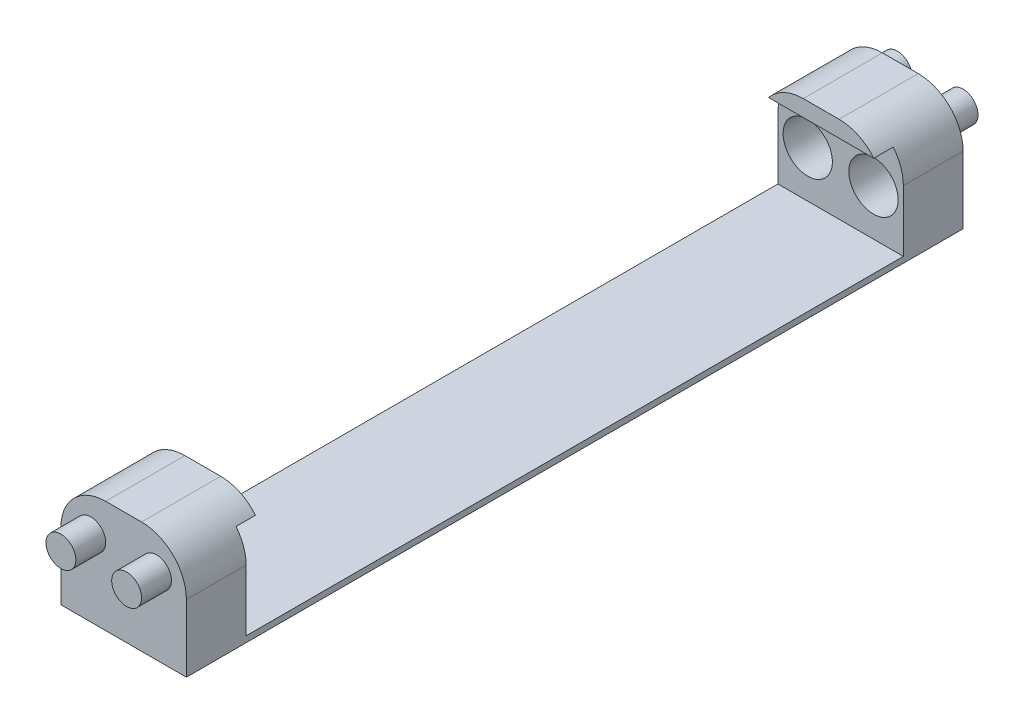
ISO-10303-21;
HEADER;
FILE_DESCRIPTION(('STEP AP214'),'2;1');
FILE_NAME('part.step','',(''),(''),'','','');
FILE_SCHEMA(('AUTOMOTIVE_DESIGN { 1 0 10303 214 1 1 1 1 }'));
ENDSEC;
DATA;
#1=APPLICATION_CONTEXT('core data for automotive mechanical design processes');
#2=APPLICATION_PROTOCOL_DEFINITION('international standard','automotive_design',2000,#1);
#3=PRODUCT_CONTEXT('',#1,'mechanical');
#4=PRODUCT('Part','Part','',(#3));
#5=PRODUCT_RELATED_PRODUCT_CATEGORY('part','',(#4));
#6=PRODUCT_DEFINITION_FORMATION('','',#4);
#7=PRODUCT_DEFINITION_CONTEXT('part definition',#1,'design');
#8=PRODUCT_DEFINITION('design','',#6,#7);
#9=PRODUCT_DEFINITION_SHAPE('','',#8);
#10=(LENGTH_UNIT() NAMED_UNIT(*) SI_UNIT(.MILLI.,.METRE.));
#11=(NAMED_UNIT(*) PLANE_ANGLE_UNIT() SI_UNIT($,.RADIAN.));
#12=(NAMED_UNIT(*) SI_UNIT($,.STERADIAN.) SOLID_ANGLE_UNIT());
#13=UNCERTAINTY_MEASURE_WITH_UNIT(LENGTH_MEASURE(1.E-05),#10,'distance_accuracy_value','');
#14=(GEOMETRIC_REPRESENTATION_CONTEXT(3) GLOBAL_UNCERTAINTY_ASSIGNED_CONTEXT((#13)) GLOBAL_UNIT_ASSIGNED_CONTEXT((#10,
#11,#12)) REPRESENTATION_CONTEXT('',''));
#15=CARTESIAN_POINT('',(0.,0.,0.));
#16=DIRECTION('',(0.,0.,1.));
#17=DIRECTION('',(1.,0.,0.));
#18=AXIS2_PLACEMENT_3D('',#15,#16,#17);
#19=CARTESIAN_POINT('',(-42.,0.,260.));
#20=DIRECTION('',(0.,0.,1.));
#21=DIRECTION('',(1.,0.,0.));
#22=AXIS2_PLACEMENT_3D('',#19,#20,#21);
#23=PLANE('',#22);
#24=CARTESIAN_POINT('',(-22.,51.,260.));
#25=DIRECTION('',(0.,0.,1.));
#26=DIRECTION('',(1.,0.,0.));
#27=AXIS2_PLACEMENT_3D('',#24,#25,#26);
#28=CIRCLE('',#27,10.);
#29=CARTESIAN_POINT('',(-12.,51.,260.));
#30=VERTEX_POINT('',#29);
#31=EDGE_CURVE('E429',#30,#30,#28,.T.);
#32=ORIENTED_EDGE('',*,*,#31,.F.);
#33=EDGE_LOOP('',(#32));
#34=FACE_BOUND('',#33,.T.);
#35=CARTESIAN_POINT('',(22.,51.,260.));
#36=DIRECTION('',(0.,0.,1.));
#37=DIRECTION('',(1.,0.,0.));
#38=AXIS2_PLACEMENT_3D('',#35,#36,#37);
#39=CIRCLE('',#38,10.);
#40=CARTESIAN_POINT('',(32.,51.,260.));
#41=VERTEX_POINT('',#40);
#42=EDGE_CURVE('E438',#41,#41,#39,.T.);
#43=ORIENTED_EDGE('',*,*,#42,.F.);
#44=EDGE_LOOP('',(#43));
#45=FACE_BOUND('',#44,.T.);
#46=DIRECTION('',(1.,0.,0.));
#47=VECTOR('',#46,1.);
#48=CARTESIAN_POINT('',(-42.,75.,260.));
#49=LINE('',#48,#47);
#50=CARTESIAN_POINT('',(-12.,75.,260.));
#51=VERTEX_POINT('',#50);
#52=CARTESIAN_POINT('',(12.,75.,260.));
#53=VERTEX_POINT('',#52);
#54=EDGE_CURVE('E204',#51,#53,#49,.T.);
#55=ORIENTED_EDGE('',*,*,#54,.F.);
#56=CARTESIAN_POINT('',(-12.,45.,260.));
#57=DIRECTION('',(0.,0.,1.));
#58=DIRECTION('',(1.,0.,0.));
#59=AXIS2_PLACEMENT_3D('',#56,#57,#58);
#60=CIRCLE('',#59,30.);
#61=CARTESIAN_POINT('',(-42.,45.,260.));
#62=VERTEX_POINT('',#61);
#63=EDGE_CURVE('E268',#51,#62,#60,.T.);
#64=ORIENTED_EDGE('',*,*,#63,.T.);
#65=DIRECTION('',(0.,-1.,0.));
#66=VECTOR('',#65,1.);
#67=CARTESIAN_POINT('',(-42.,0.,260.));
#68=LINE('',#67,#66);
#69=CARTESIAN_POINT('',(-42.,0.,260.));
#70=VERTEX_POINT('',#69);
#71=EDGE_CURVE('E171',#62,#70,#68,.T.);
#72=ORIENTED_EDGE('',*,*,#71,.T.);
#73=DIRECTION('',(1.,0.,0.));
#74=VECTOR('',#73,1.);
#75=CARTESIAN_POINT('',(-42.,0.,260.));
#76=LINE('',#75,#74);
#77=CARTESIAN_POINT('',(42.,0.,260.));
#78=VERTEX_POINT('',#77);
#79=EDGE_CURVE('E168',#70,#78,#76,.T.);
#80=ORIENTED_EDGE('',*,*,#79,.T.);
#81=DIRECTION('',(0.,-1.,0.));
#82=VECTOR('',#81,1.);
#83=CARTESIAN_POINT('',(42.,0.,260.));
#84=LINE('',#83,#82);
#85=CARTESIAN_POINT('',(42.,45.,260.));
#86=VERTEX_POINT('',#85);
#87=EDGE_CURVE('E154',#86,#78,#84,.T.);
#88=ORIENTED_EDGE('',*,*,#87,.F.);
#89=CARTESIAN_POINT('',(12.,45.,260.));
#90=DIRECTION('',(0.,0.,1.));
#91=DIRECTION('',(1.,0.,0.));
#92=AXIS2_PLACEMENT_3D('',#89,#90,#91);
#93=CIRCLE('',#92,30.);
#94=EDGE_CURVE('E266',#86,#53,#93,.T.);
#95=ORIENTED_EDGE('',*,*,#94,.T.);
#96=EDGE_LOOP('',(#55,#64,#72,#80,#88,#95));
#97=FACE_BOUND('',#96,.T.);
#98=ADVANCED_FACE('F38',(#34,#45,#97),#23,.T.);
#99=CARTESIAN_POINT('',(-42.,75.,207.));
#100=DIRECTION('',(0.,1.,0.));
#101=DIRECTION('',(0.,0.,1.));
#102=AXIS2_PLACEMENT_3D('',#99,#100,#101);
#103=PLANE('',#102);
#104=DIRECTION('',(1.,0.,0.));
#105=VECTOR('',#104,1.);
#106=CARTESIAN_POINT('',(-42.,75.,207.));
#107=LINE('',#106,#105);
#108=CARTESIAN_POINT('',(-12.,75.,207.));
#109=VERTEX_POINT('',#108);
#110=CARTESIAN_POINT('',(12.,75.,207.));
#111=VERTEX_POINT('',#110);
#112=EDGE_CURVE('E208',#109,#111,#107,.T.);
#113=ORIENTED_EDGE('',*,*,#112,.F.);
#114=DIRECTION('',(0.,0.,1.));
#115=VECTOR('',#114,1.);
#116=CARTESIAN_POINT('',(-12.,75.,260.));
#117=LINE('',#116,#115);
#118=EDGE_CURVE('E263',#109,#51,#117,.T.);
#119=ORIENTED_EDGE('',*,*,#118,.T.);
#120=ORIENTED_EDGE('',*,*,#54,.T.);
#121=DIRECTION('',(0.,0.,1.));
#122=VECTOR('',#121,1.);
#123=CARTESIAN_POINT('',(12.,75.,207.));
#124=LINE('',#123,#122);
#125=EDGE_CURVE('E261',#53,#111,#124,.F.);
#126=ORIENTED_EDGE('',*,*,#125,.T.);
#127=EDGE_LOOP('',(#113,#119,#120,#126));
#128=FACE_BOUND('',#127,.T.);
#129=ADVANCED_FACE('F329',(#128),#103,.T.);
#130=CARTESIAN_POINT('',(-42.,64.,207.));
#131=DIRECTION('',(0.,0.,-1.));
#132=DIRECTION('',(-1.,0.,0.));
#133=AXIS2_PLACEMENT_3D('',#130,#131,#132);
#134=PLANE('',#133);
#135=DIRECTION('',(1.,0.,0.));
#136=VECTOR('',#135,1.);
#137=CARTESIAN_POINT('',(-42.,64.,207.));
#138=LINE('',#137,#136);
#139=CARTESIAN_POINT('',(-35.2163735324878,64.,207.));
#140=VERTEX_POINT('',#139);
#141=CARTESIAN_POINT('',(35.2163735324878,64.,207.));
#142=VERTEX_POINT('',#141);
#143=EDGE_CURVE('E210',#140,#142,#138,.T.);
#144=ORIENTED_EDGE('',*,*,#143,.F.);
#145=CARTESIAN_POINT('',(-12.,45.,207.));
#146=DIRECTION('',(0.,0.,-1.));
#147=DIRECTION('',(-1.,0.,0.));
#148=AXIS2_PLACEMENT_3D('',#145,#146,#147);
#149=CIRCLE('',#148,30.);
#150=EDGE_CURVE('E11',#140,#109,#149,.T.);
#151=ORIENTED_EDGE('',*,*,#150,.T.);
#152=ORIENTED_EDGE('',*,*,#112,.T.);
#153=CARTESIAN_POINT('',(12.,45.,207.));
#154=DIRECTION('',(0.,0.,-1.));
#155=DIRECTION('',(-1.,0.,0.));
#156=AXIS2_PLACEMENT_3D('',#153,#154,#155);
#157=CIRCLE('',#156,30.);
#158=EDGE_CURVE('E47',#111,#142,#157,.T.);
#159=ORIENTED_EDGE('',*,*,#158,.T.);
#160=EDGE_LOOP('',(#144,#151,#152,#159));
#161=FACE_BOUND('',#160,.T.);
#162=ADVANCED_FACE('F335',(#161),#134,.T.);
#163=CARTESIAN_POINT('',(-42.,64.,220.));
#164=DIRECTION('',(0.,-1.,0.));
#165=DIRECTION('',(0.,0.,-1.));
#166=AXIS2_PLACEMENT_3D('',#163,#164,#165);
#167=PLANE('',#166);
#168=DIRECTION('',(1.,0.,0.));
#169=VECTOR('',#168,1.);
#170=CARTESIAN_POINT('',(-42.,64.,220.));
#171=LINE('',#170,#169);
#172=CARTESIAN_POINT('',(-35.2163735324878,64.,220.));
#173=VERTEX_POINT('',#172);
#174=CARTESIAN_POINT('',(35.2163735324878,64.,220.));
#175=VERTEX_POINT('',#174);
#176=EDGE_CURVE('E212',#173,#175,#171,.T.);
#177=ORIENTED_EDGE('',*,*,#176,.F.);
#178=DIRECTION('',(0.,0.,-1.));
#179=VECTOR('',#178,1.);
#180=CARTESIAN_POINT('',(-35.2163735324878,64.,220.));
#181=LINE('',#180,#179);
#182=EDGE_CURVE('E61',#173,#140,#181,.T.);
#183=ORIENTED_EDGE('',*,*,#182,.T.);
#184=ORIENTED_EDGE('',*,*,#143,.T.);
#185=DIRECTION('',(0.,0.,1.));
#186=VECTOR('',#185,1.);
#187=CARTESIAN_POINT('',(35.2163735324878,64.,207.));
#188=LINE('',#187,#186);
#189=EDGE_CURVE('E274',#142,#175,#188,.T.);
#190=ORIENTED_EDGE('',*,*,#189,.T.);
#191=EDGE_LOOP('',(#177,#183,#184,#190));
#192=FACE_BOUND('',#191,.T.);
#193=ADVANCED_FACE('F364',(#192),#167,.T.);
#194=CARTESIAN_POINT('',(-42.,4.,220.));
#195=DIRECTION('',(0.,0.,-1.));
#196=DIRECTION('',(-1.,0.,0.));
#197=AXIS2_PLACEMENT_3D('',#194,#195,#196);
#198=PLANE('',#197);
#199=CARTESIAN_POINT('',(22.,35.,220.));
#200=DIRECTION('',(0.,0.,-1.));
#201=DIRECTION('',(-1.,0.,0.));
#202=AXIS2_PLACEMENT_3D('',#199,#200,#201);
#203=CIRCLE('',#202,16.5);
#204=CARTESIAN_POINT('',(5.5,35.,220.));
#205=VERTEX_POINT('',#204);
#206=EDGE_CURVE('E165',#205,#205,#203,.F.);
#207=ORIENTED_EDGE('',*,*,#206,.T.);
#208=EDGE_LOOP('',(#207));
#209=FACE_BOUND('',#208,.T.);
#210=CARTESIAN_POINT('',(-22.,35.,220.));
#211=DIRECTION('',(0.,0.,-1.));
#212=DIRECTION('',(-1.,0.,0.));
#213=AXIS2_PLACEMENT_3D('',#210,#211,#212);
#214=CIRCLE('',#213,16.5);
#215=CARTESIAN_POINT('',(-38.5,35.,220.));
#216=VERTEX_POINT('',#215);
#217=EDGE_CURVE('E279',#216,#216,#214,.F.);
#218=ORIENTED_EDGE('',*,*,#217,.T.);
#219=EDGE_LOOP('',(#218));
#220=FACE_BOUND('',#219,.T.);
#221=DIRECTION('',(0.,1.,0.));
#222=VECTOR('',#221,1.);
#223=CARTESIAN_POINT('',(-42.,4.,220.));
#224=LINE('',#223,#222);
#225=CARTESIAN_POINT('',(-42.,4.,220.));
#226=VERTEX_POINT('',#225);
#227=CARTESIAN_POINT('',(-42.,45.,220.));
#228=VERTEX_POINT('',#227);
#229=EDGE_CURVE('E176',#226,#228,#224,.T.);
#230=ORIENTED_EDGE('',*,*,#229,.T.);
#231=CARTESIAN_POINT('',(-12.,45.,220.));
#232=DIRECTION('',(0.,0.,-1.));
#233=DIRECTION('',(-1.,0.,0.));
#234=AXIS2_PLACEMENT_3D('',#231,#232,#233);
#235=CIRCLE('',#234,30.);
#236=EDGE_CURVE('E272',#228,#173,#235,.T.);
#237=ORIENTED_EDGE('',*,*,#236,.T.);
#238=ORIENTED_EDGE('',*,*,#176,.T.);
#239=CARTESIAN_POINT('',(12.,45.,220.));
#240=DIRECTION('',(0.,0.,-1.));
#241=DIRECTION('',(-1.,0.,0.));
#242=AXIS2_PLACEMENT_3D('',#239,#240,#241);
#243=CIRCLE('',#242,30.);
#244=CARTESIAN_POINT('',(42.,45.,220.));
#245=VERTEX_POINT('',#244);
#246=EDGE_CURVE('E270',#175,#245,#243,.T.);
#247=ORIENTED_EDGE('',*,*,#246,.T.);
#248=DIRECTION('',(0.,1.,0.));
#249=VECTOR('',#248,1.);
#250=CARTESIAN_POINT('',(42.,4.,220.));
#251=LINE('',#250,#249);
#252=CARTESIAN_POINT('',(42.,4.,220.));
#253=VERTEX_POINT('',#252);
#254=EDGE_CURVE('E189',#253,#245,#251,.T.);
#255=ORIENTED_EDGE('',*,*,#254,.F.);
#256=DIRECTION('',(1.,0.,0.));
#257=VECTOR('',#256,1.);
#258=CARTESIAN_POINT('',(-42.,4.,220.));
#259=LINE('',#258,#257);
#260=EDGE_CURVE('E215',#226,#253,#259,.T.);
#261=ORIENTED_EDGE('',*,*,#260,.F.);
#262=EDGE_LOOP('',(#230,#237,#238,#247,#255,#261));
#263=FACE_BOUND('',#262,.T.);
#264=ADVANCED_FACE('F361',(#209,#220,#263),#198,.T.);
#265=CARTESIAN_POINT('',(-42.,4.,220.));
#266=DIRECTION('',(0.,1.,0.));
#267=DIRECTION('',(0.,0.,1.));
#268=AXIS2_PLACEMENT_3D('',#265,#266,#267);
#269=PLANE('',#268);
#270=ORIENTED_EDGE('',*,*,#260,.T.);
#271=DIRECTION('',(0.,0.,1.));
#272=VECTOR('',#271,1.);
#273=CARTESIAN_POINT('',(42.,4.,220.));
#274=LINE('',#273,#272);
#275=CARTESIAN_POINT('',(42.,4.,-220.));
#276=VERTEX_POINT('',#275);
#277=EDGE_CURVE('E186',#276,#253,#274,.T.);
#278=ORIENTED_EDGE('',*,*,#277,.F.);
#279=DIRECTION('',(1.,0.,0.));
#280=VECTOR('',#279,1.);
#281=CARTESIAN_POINT('',(-42.,4.,-220.));
#282=LINE('',#281,#280);
#283=CARTESIAN_POINT('',(-42.,4.,-220.));
#284=VERTEX_POINT('',#283);
#285=EDGE_CURVE('E217',#284,#276,#282,.T.);
#286=ORIENTED_EDGE('',*,*,#285,.F.);
#287=DIRECTION('',(0.,0.,1.));
#288=VECTOR('',#287,1.);
#289=CARTESIAN_POINT('',(-42.,4.,220.));
#290=LINE('',#289,#288);
#291=EDGE_CURVE('E199',#284,#226,#290,.T.);
#292=ORIENTED_EDGE('',*,*,#291,.T.);
#293=EDGE_LOOP('',(#270,#278,#286,#292));
#294=FACE_BOUND('',#293,.T.);
#295=ADVANCED_FACE('F372',(#294),#269,.T.);
#296=CARTESIAN_POINT('',(-42.,4.,-220.));
#297=DIRECTION('',(0.,0.,1.));
#298=DIRECTION('',(1.,0.,0.));
#299=AXIS2_PLACEMENT_3D('',#296,#297,#298);
#300=PLANE('',#299);
#301=CARTESIAN_POINT('',(22.,35.,-220.));
#302=DIRECTION('',(0.,0.,1.));
#303=DIRECTION('',(1.,0.,0.));
#304=AXIS2_PLACEMENT_3D('',#301,#302,#303);
#305=CIRCLE('',#304,16.5);
#306=CARTESIAN_POINT('',(38.5,35.,-220.));
#307=VERTEX_POINT('',#306);
#308=EDGE_CURVE('E42',#307,#307,#305,.F.);
#309=ORIENTED_EDGE('',*,*,#308,.T.);
#310=EDGE_LOOP('',(#309));
#311=FACE_BOUND('',#310,.T.);
#312=CARTESIAN_POINT('',(-22.,35.,-220.));
#313=DIRECTION('',(0.,0.,1.));
#314=DIRECTION('',(1.,0.,0.));
#315=AXIS2_PLACEMENT_3D('',#312,#313,#314);
#316=CIRCLE('',#315,16.5);
#317=CARTESIAN_POINT('',(-5.5,35.,-220.));
#318=VERTEX_POINT('',#317);
#319=EDGE_CURVE('E277',#318,#318,#316,.F.);
#320=ORIENTED_EDGE('',*,*,#319,.T.);
#321=EDGE_LOOP('',(#320));
#322=FACE_BOUND('',#321,.T.);
#323=DIRECTION('',(1.,0.,0.));
#324=VECTOR('',#323,1.);
#325=CARTESIAN_POINT('',(-42.,64.,-220.));
#326=LINE('',#325,#324);
#327=CARTESIAN_POINT('',(-35.2163735324878,64.,-220.));
#328=VERTEX_POINT('',#327);
#329=CARTESIAN_POINT('',(35.2163735324878,64.,-220.));
#330=VERTEX_POINT('',#329);
#331=EDGE_CURVE('E220',#328,#330,#326,.T.);
#332=ORIENTED_EDGE('',*,*,#331,.F.);
#333=CARTESIAN_POINT('',(-12.,45.,-220.));
#334=DIRECTION('',(0.,0.,1.));
#335=DIRECTION('',(1.,0.,0.));
#336=AXIS2_PLACEMENT_3D('',#333,#334,#335);
#337=CIRCLE('',#336,30.);
#338=CARTESIAN_POINT('',(-42.,45.,-220.));
#339=VERTEX_POINT('',#338);
#340=EDGE_CURVE('E247',#328,#339,#337,.T.);
#341=ORIENTED_EDGE('',*,*,#340,.T.);
#342=DIRECTION('',(0.,-1.,0.));
#343=VECTOR('',#342,1.);
#344=CARTESIAN_POINT('',(-42.,4.,-220.));
#345=LINE('',#344,#343);
#346=EDGE_CURVE('E197',#339,#284,#345,.T.);
#347=ORIENTED_EDGE('',*,*,#346,.T.);
#348=ORIENTED_EDGE('',*,*,#285,.T.);
#349=DIRECTION('',(0.,-1.,0.));
#350=VECTOR('',#349,1.);
#351=CARTESIAN_POINT('',(42.,4.,-220.));
#352=LINE('',#351,#350);
#353=CARTESIAN_POINT('',(42.,45.,-220.));
#354=VERTEX_POINT('',#353);
#355=EDGE_CURVE('E181',#354,#276,#352,.T.);
#356=ORIENTED_EDGE('',*,*,#355,.F.);
#357=CARTESIAN_POINT('',(12.,45.,-220.));
#358=DIRECTION('',(0.,0.,1.));
#359=DIRECTION('',(1.,0.,0.));
#360=AXIS2_PLACEMENT_3D('',#357,#358,#359);
#361=CIRCLE('',#360,30.);
#362=EDGE_CURVE('E245',#354,#330,#361,.T.);
#363=ORIENTED_EDGE('',*,*,#362,.T.);
#364=EDGE_LOOP('',(#332,#341,#347,#348,#356,#363));
#365=FACE_BOUND('',#364,.T.);
#366=ADVANCED_FACE('F306',(#311,#322,#365),#300,.T.);
#367=CARTESIAN_POINT('',(-42.,64.,-220.));
#368=DIRECTION('',(0.,-1.,0.));
#369=DIRECTION('',(0.,0.,-1.));
#370=AXIS2_PLACEMENT_3D('',#367,#368,#369);
#371=PLANE('',#370);
#372=DIRECTION('',(1.,0.,0.));
#373=VECTOR('',#372,1.);
#374=CARTESIAN_POINT('',(-42.,64.,-207.));
#375=LINE('',#374,#373);
#376=CARTESIAN_POINT('',(-35.2163735324878,64.,-207.));
#377=VERTEX_POINT('',#376);
#378=CARTESIAN_POINT('',(35.2163735324878,64.,-207.));
#379=VERTEX_POINT('',#378);
#380=EDGE_CURVE('E223',#377,#379,#375,.T.);
#381=ORIENTED_EDGE('',*,*,#380,.F.);
#382=DIRECTION('',(0.,0.,-1.));
#383=VECTOR('',#382,1.);
#384=CARTESIAN_POINT('',(-35.2163735324878,64.,-207.));
#385=LINE('',#384,#383);
#386=EDGE_CURVE('E243',#377,#328,#385,.T.);
#387=ORIENTED_EDGE('',*,*,#386,.T.);
#388=ORIENTED_EDGE('',*,*,#331,.T.);
#389=DIRECTION('',(0.,0.,1.));
#390=VECTOR('',#389,1.);
#391=CARTESIAN_POINT('',(35.2163735324878,64.,-220.));
#392=LINE('',#391,#390);
#393=EDGE_CURVE('E241',#330,#379,#392,.T.);
#394=ORIENTED_EDGE('',*,*,#393,.T.);
#395=EDGE_LOOP('',(#381,#387,#388,#394));
#396=FACE_BOUND('',#395,.T.);
#397=ADVANCED_FACE('F400',(#396),#371,.T.);
#398=CARTESIAN_POINT('',(-42.,64.,-207.));
#399=DIRECTION('',(0.,0.,1.));
#400=DIRECTION('',(1.,0.,0.));
#401=AXIS2_PLACEMENT_3D('',#398,#399,#400);
#402=PLANE('',#401);
#403=DIRECTION('',(1.,0.,0.));
#404=VECTOR('',#403,1.);
#405=CARTESIAN_POINT('',(-42.,75.,-207.));
#406=LINE('',#405,#404);
#407=CARTESIAN_POINT('',(-12.,75.,-207.));
#408=VERTEX_POINT('',#407);
#409=CARTESIAN_POINT('',(12.,75.,-207.));
#410=VERTEX_POINT('',#409);
#411=EDGE_CURVE('E226',#408,#410,#406,.T.);
#412=ORIENTED_EDGE('',*,*,#411,.F.);
#413=CARTESIAN_POINT('',(-12.,45.,-207.));
#414=DIRECTION('',(0.,0.,1.));
#415=DIRECTION('',(1.,0.,0.));
#416=AXIS2_PLACEMENT_3D('',#413,#414,#415);
#417=CIRCLE('',#416,30.);
#418=EDGE_CURVE('E239',#408,#377,#417,.T.);
#419=ORIENTED_EDGE('',*,*,#418,.T.);
#420=ORIENTED_EDGE('',*,*,#380,.T.);
#421=CARTESIAN_POINT('',(12.,45.,-207.));
#422=DIRECTION('',(0.,0.,1.));
#423=DIRECTION('',(1.,0.,0.));
#424=AXIS2_PLACEMENT_3D('',#421,#422,#423);
#425=CIRCLE('',#424,30.);
#426=EDGE_CURVE('E237',#379,#410,#425,.T.);
#427=ORIENTED_EDGE('',*,*,#426,.T.);
#428=EDGE_LOOP('',(#412,#419,#420,#427));
#429=FACE_BOUND('',#428,.T.);
#430=ADVANCED_FACE('F391',(#429),#402,.T.);
#431=CARTESIAN_POINT('',(-42.,75.,-207.));
#432=DIRECTION('',(0.,1.,0.));
#433=DIRECTION('',(0.,0.,1.));
#434=AXIS2_PLACEMENT_3D('',#431,#432,#433);
#435=PLANE('',#434);
#436=DIRECTION('',(1.,0.,0.));
#437=VECTOR('',#436,1.);
#438=CARTESIAN_POINT('',(-42.,75.,-260.));
#439=LINE('',#438,#437);
#440=CARTESIAN_POINT('',(-12.,75.,-260.));
#441=VERTEX_POINT('',#440);
#442=CARTESIAN_POINT('',(12.,75.,-260.));
#443=VERTEX_POINT('',#442);
#444=EDGE_CURVE('E229',#441,#443,#439,.T.);
#445=ORIENTED_EDGE('',*,*,#444,.F.);
#446=DIRECTION('',(0.,0.,1.));
#447=VECTOR('',#446,1.);
#448=CARTESIAN_POINT('',(-12.,75.,-207.));
#449=LINE('',#448,#447);
#450=EDGE_CURVE('E234',#441,#408,#449,.T.);
#451=ORIENTED_EDGE('',*,*,#450,.T.);
#452=ORIENTED_EDGE('',*,*,#411,.T.);
#453=DIRECTION('',(0.,0.,1.));
#454=VECTOR('',#453,1.);
#455=CARTESIAN_POINT('',(12.,75.,-207.));
#456=LINE('',#455,#454);
#457=EDGE_CURVE('E207',#410,#443,#456,.F.);
#458=ORIENTED_EDGE('',*,*,#457,.T.);
#459=EDGE_LOOP('',(#445,#451,#452,#458));
#460=FACE_BOUND('',#459,.T.);
#461=ADVANCED_FACE('F388',(#460),#435,.T.);
#462=CARTESIAN_POINT('',(-42.,0.,-260.));
#463=DIRECTION('',(0.,0.,-1.));
#464=DIRECTION('',(-1.,0.,0.));
#465=AXIS2_PLACEMENT_3D('',#462,#463,#464);
#466=PLANE('',#465);
#467=CARTESIAN_POINT('',(22.,51.,-260.));
#468=DIRECTION('',(0.,0.,-1.));
#469=DIRECTION('',(-1.,0.,0.));
#470=AXIS2_PLACEMENT_3D('',#467,#468,#469);
#471=CIRCLE('',#470,10.);
#472=CARTESIAN_POINT('',(12.,51.,-260.));
#473=VERTEX_POINT('',#472);
#474=EDGE_CURVE('E420',#473,#473,#471,.T.);
#475=ORIENTED_EDGE('',*,*,#474,.F.);
#476=EDGE_LOOP('',(#475));
#477=FACE_BOUND('',#476,.T.);
#478=CARTESIAN_POINT('',(-22.,51.,-260.));
#479=DIRECTION('',(0.,0.,-1.));
#480=DIRECTION('',(-1.,0.,0.));
#481=AXIS2_PLACEMENT_3D('',#478,#479,#480);
#482=CIRCLE('',#481,10.);
#483=CARTESIAN_POINT('',(-32.,51.,-260.));
#484=VERTEX_POINT('',#483);
#485=EDGE_CURVE('E423',#484,#484,#482,.T.);
#486=ORIENTED_EDGE('',*,*,#485,.F.);
#487=EDGE_LOOP('',(#486));
#488=FACE_BOUND('',#487,.T.);
#489=DIRECTION('',(0.,1.,0.));
#490=VECTOR('',#489,1.);
#491=CARTESIAN_POINT('',(-42.,0.,-260.));
#492=LINE('',#491,#490);
#493=CARTESIAN_POINT('',(-42.,0.,-260.));
#494=VERTEX_POINT('',#493);
#495=CARTESIAN_POINT('',(-42.,45.,-260.));
#496=VERTEX_POINT('',#495);
#497=EDGE_CURVE('E194',#494,#496,#492,.T.);
#498=ORIENTED_EDGE('',*,*,#497,.T.);
#499=CARTESIAN_POINT('',(-12.,45.,-260.));
#500=DIRECTION('',(0.,0.,-1.));
#501=DIRECTION('',(-1.,0.,0.));
#502=AXIS2_PLACEMENT_3D('',#499,#500,#501);
#503=CIRCLE('',#502,30.);
#504=EDGE_CURVE('E255',#496,#441,#503,.T.);
#505=ORIENTED_EDGE('',*,*,#504,.T.);
#506=ORIENTED_EDGE('',*,*,#444,.T.);
#507=CARTESIAN_POINT('',(12.,45.,-260.));
#508=DIRECTION('',(0.,0.,-1.));
#509=DIRECTION('',(-1.,0.,0.));
#510=AXIS2_PLACEMENT_3D('',#507,#508,#509);
#511=CIRCLE('',#510,30.);
#512=CARTESIAN_POINT('',(42.,45.,-260.));
#513=VERTEX_POINT('',#512);
#514=EDGE_CURVE('E253',#443,#513,#511,.T.);
#515=ORIENTED_EDGE('',*,*,#514,.T.);
#516=DIRECTION('',(0.,1.,0.));
#517=VECTOR('',#516,1.);
#518=CARTESIAN_POINT('',(42.,0.,-260.));
#519=LINE('',#518,#517);
#520=CARTESIAN_POINT('',(42.,0.,-260.));
#521=VERTEX_POINT('',#520);
#522=EDGE_CURVE('E179',#521,#513,#519,.T.);
#523=ORIENTED_EDGE('',*,*,#522,.F.);
#524=DIRECTION('',(1.,0.,0.));
#525=VECTOR('',#524,1.);
#526=CARTESIAN_POINT('',(-42.,0.,-260.));
#527=LINE('',#526,#525);
#528=EDGE_CURVE('E175',#494,#521,#527,.T.);
#529=ORIENTED_EDGE('',*,*,#528,.F.);
#530=EDGE_LOOP('',(#498,#505,#506,#515,#523,#529));
#531=FACE_BOUND('',#530,.T.);
#532=ADVANCED_FACE('F381',(#477,#488,#531),#466,.T.);
#533=CARTESIAN_POINT('',(-42.,0.,260.));
#534=DIRECTION('',(0.,-1.,0.));
#535=DIRECTION('',(0.,0.,-1.));
#536=AXIS2_PLACEMENT_3D('',#533,#534,#535);
#537=PLANE('',#536);
#538=ORIENTED_EDGE('',*,*,#528,.T.);
#539=DIRECTION('',(0.,0.,-1.));
#540=VECTOR('',#539,1.);
#541=CARTESIAN_POINT('',(42.,0.,260.));
#542=LINE('',#541,#540);
#543=EDGE_CURVE('E159',#78,#521,#542,.T.);
#544=ORIENTED_EDGE('',*,*,#543,.F.);
#545=ORIENTED_EDGE('',*,*,#79,.F.);
#546=DIRECTION('',(0.,0.,-1.));
#547=VECTOR('',#546,1.);
#548=CARTESIAN_POINT('',(-42.,0.,260.));
#549=LINE('',#548,#547);
#550=EDGE_CURVE('E192',#70,#494,#549,.T.);
#551=ORIENTED_EDGE('',*,*,#550,.T.);
#552=EDGE_LOOP('',(#538,#544,#545,#551));
#553=FACE_BOUND('',#552,.T.);
#554=ADVANCED_FACE('F178',(#553),#537,.T.);
#555=CARTESIAN_POINT('',(-42.,0.,0.));
#556=DIRECTION('',(1.,0.,0.));
#557=DIRECTION('',(0.,0.,-1.));
#558=AXIS2_PLACEMENT_3D('',#555,#556,#557);
#559=PLANE('',#558);
#560=ORIENTED_EDGE('',*,*,#346,.F.);
#561=DIRECTION('',(0.,0.,1.));
#562=VECTOR('',#561,1.);
#563=CARTESIAN_POINT('',(-42.,45.,-260.));
#564=LINE('',#563,#562);
#565=EDGE_CURVE('E251',#339,#496,#564,.F.);
#566=ORIENTED_EDGE('',*,*,#565,.T.);
#567=ORIENTED_EDGE('',*,*,#497,.F.);
#568=ORIENTED_EDGE('',*,*,#550,.F.);
#569=ORIENTED_EDGE('',*,*,#71,.F.);
#570=DIRECTION('',(0.,0.,1.));
#571=VECTOR('',#570,1.);
#572=CARTESIAN_POINT('',(-42.,45.,207.));
#573=LINE('',#572,#571);
#574=EDGE_CURVE('E249',#62,#228,#573,.F.);
#575=ORIENTED_EDGE('',*,*,#574,.T.);
#576=ORIENTED_EDGE('',*,*,#229,.F.);
#577=ORIENTED_EDGE('',*,*,#291,.F.);
#578=EDGE_LOOP('',(#560,#566,#567,#568,#569,#575,#576,#577));
#579=FACE_BOUND('',#578,.T.);
#580=ADVANCED_FACE('F376',(#579),#559,.F.);
#581=CARTESIAN_POINT('',(42.,0.,0.));
#582=DIRECTION('',(1.,0.,0.));
#583=DIRECTION('',(0.,0.,-1.));
#584=AXIS2_PLACEMENT_3D('',#581,#582,#583);
#585=PLANE('',#584);
#586=ORIENTED_EDGE('',*,*,#522,.T.);
#587=DIRECTION('',(0.,0.,1.));
#588=VECTOR('',#587,1.);
#589=CARTESIAN_POINT('',(42.,45.,0.));
#590=LINE('',#589,#588);
#591=EDGE_CURVE('E258',#513,#354,#590,.T.);
#592=ORIENTED_EDGE('',*,*,#591,.T.);
#593=ORIENTED_EDGE('',*,*,#355,.T.);
#594=ORIENTED_EDGE('',*,*,#277,.T.);
#595=ORIENTED_EDGE('',*,*,#254,.T.);
#596=DIRECTION('',(0.,0.,1.));
#597=VECTOR('',#596,1.);
#598=CARTESIAN_POINT('',(42.,45.,0.));
#599=LINE('',#598,#597);
#600=EDGE_CURVE('E163',#245,#86,#599,.T.);
#601=ORIENTED_EDGE('',*,*,#600,.T.);
#602=ORIENTED_EDGE('',*,*,#87,.T.);
#603=ORIENTED_EDGE('',*,*,#543,.T.);
#604=EDGE_LOOP('',(#586,#592,#593,#594,#595,#601,#602,#603));
#605=FACE_BOUND('',#604,.T.);
#606=ADVANCED_FACE('F157',(#605),#585,.T.);
#607=CARTESIAN_POINT('',(-12.,45.,-207.));
#608=DIRECTION('',(0.,0.,-1.));
#609=DIRECTION('',(-1.,0.,0.));
#610=AXIS2_PLACEMENT_3D('',#607,#608,#609);
#611=CYLINDRICAL_SURFACE('',#610,30.);
#612=ORIENTED_EDGE('',*,*,#504,.F.);
#613=ORIENTED_EDGE('',*,*,#565,.F.);
#614=ORIENTED_EDGE('',*,*,#340,.F.);
#615=ORIENTED_EDGE('',*,*,#386,.F.);
#616=ORIENTED_EDGE('',*,*,#418,.F.);
#617=ORIENTED_EDGE('',*,*,#450,.F.);
#618=EDGE_LOOP('',(#612,#613,#614,#615,#616,#617));
#619=FACE_BOUND('',#618,.T.);
#620=ADVANCED_FACE('F343',(#619),#611,.T.);
#621=CARTESIAN_POINT('',(12.,45.,0.));
#622=DIRECTION('',(0.,0.,1.));
#623=DIRECTION('',(1.,0.,0.));
#624=AXIS2_PLACEMENT_3D('',#621,#622,#623);
#625=CYLINDRICAL_SURFACE('',#624,30.);
#626=ORIENTED_EDGE('',*,*,#514,.F.);
#627=ORIENTED_EDGE('',*,*,#457,.F.);
#628=ORIENTED_EDGE('',*,*,#426,.F.);
#629=ORIENTED_EDGE('',*,*,#393,.F.);
#630=ORIENTED_EDGE('',*,*,#362,.F.);
#631=ORIENTED_EDGE('',*,*,#591,.F.);
#632=EDGE_LOOP('',(#626,#627,#628,#629,#630,#631));
#633=FACE_BOUND('',#632,.T.);
#634=ADVANCED_FACE('F346',(#633),#625,.T.);
#635=CARTESIAN_POINT('',(-12.,45.,207.));
#636=DIRECTION('',(0.,0.,-1.));
#637=DIRECTION('',(-1.,0.,0.));
#638=AXIS2_PLACEMENT_3D('',#635,#636,#637);
#639=CYLINDRICAL_SURFACE('',#638,30.);
#640=ORIENTED_EDGE('',*,*,#236,.F.);
#641=ORIENTED_EDGE('',*,*,#574,.F.);
#642=ORIENTED_EDGE('',*,*,#63,.F.);
#643=ORIENTED_EDGE('',*,*,#118,.F.);
#644=ORIENTED_EDGE('',*,*,#150,.F.);
#645=ORIENTED_EDGE('',*,*,#182,.F.);
#646=EDGE_LOOP('',(#640,#641,#642,#643,#644,#645));
#647=FACE_BOUND('',#646,.T.);
#648=ADVANCED_FACE('F349',(#647),#639,.T.);
#649=CARTESIAN_POINT('',(12.,45.,0.));
#650=DIRECTION('',(0.,0.,1.));
#651=DIRECTION('',(1.,0.,0.));
#652=AXIS2_PLACEMENT_3D('',#649,#650,#651);
#653=CYLINDRICAL_SURFACE('',#652,30.);
#654=ORIENTED_EDGE('',*,*,#158,.F.);
#655=ORIENTED_EDGE('',*,*,#125,.F.);
#656=ORIENTED_EDGE('',*,*,#94,.F.);
#657=ORIENTED_EDGE('',*,*,#600,.F.);
#658=ORIENTED_EDGE('',*,*,#246,.F.);
#659=ORIENTED_EDGE('',*,*,#189,.F.);
#660=EDGE_LOOP('',(#654,#655,#656,#657,#658,#659));
#661=FACE_BOUND('',#660,.T.);
#662=ADVANCED_FACE('F40',(#661),#653,.T.);
#663=CARTESIAN_POINT('',(-22.,35.,-250.));
#664=DIRECTION('',(0.,0.,1.));
#665=DIRECTION('',(1.,0.,0.));
#666=AXIS2_PLACEMENT_3D('',#663,#664,#665);
#667=PLANE('',#666);
#668=CARTESIAN_POINT('',(-22.,35.,-250.));
#669=DIRECTION('',(0.,0.,1.));
#670=DIRECTION('',(1.,0.,0.));
#671=AXIS2_PLACEMENT_3D('',#668,#669,#670);
#672=CIRCLE('',#671,16.5);
#673=CARTESIAN_POINT('',(-5.5,35.,-250.));
#674=VERTEX_POINT('',#673);
#675=EDGE_CURVE('E295',#674,#674,#672,.T.);
#676=ORIENTED_EDGE('',*,*,#675,.T.);
#677=EDGE_LOOP('',(#676));
#678=FACE_BOUND('',#677,.T.);
#679=ADVANCED_FACE('F323',(#678),#667,.T.);
#680=CARTESIAN_POINT('',(-22.,35.,250.));
#681=DIRECTION('',(0.,0.,-1.));
#682=DIRECTION('',(-1.,0.,0.));
#683=AXIS2_PLACEMENT_3D('',#680,#681,#682);
#684=CYLINDRICAL_SURFACE('',#683,16.5);
#685=ORIENTED_EDGE('',*,*,#319,.F.);
#686=EDGE_LOOP('',(#685));
#687=FACE_BOUND('',#686,.T.);
#688=ORIENTED_EDGE('',*,*,#675,.F.);
#689=EDGE_LOOP('',(#688));
#690=FACE_BOUND('',#689,.T.);
#691=ADVANCED_FACE('F318',(#687,#690),#684,.F.);
#692=CARTESIAN_POINT('',(22.,35.,-250.));
#693=DIRECTION('',(0.,0.,1.));
#694=DIRECTION('',(1.,0.,0.));
#695=AXIS2_PLACEMENT_3D('',#692,#693,#694);
#696=PLANE('',#695);
#697=CARTESIAN_POINT('',(22.,35.,-250.));
#698=DIRECTION('',(0.,0.,1.));
#699=DIRECTION('',(1.,0.,0.));
#700=AXIS2_PLACEMENT_3D('',#697,#698,#699);
#701=CIRCLE('',#700,16.5);
#702=CARTESIAN_POINT('',(38.5,35.,-250.));
#703=VERTEX_POINT('',#702);
#704=EDGE_CURVE('E286',#703,#703,#701,.T.);
#705=ORIENTED_EDGE('',*,*,#704,.T.);
#706=EDGE_LOOP('',(#705));
#707=FACE_BOUND('',#706,.T.);
#708=ADVANCED_FACE('F312',(#707),#696,.T.);
#709=CARTESIAN_POINT('',(22.,35.,250.));
#710=DIRECTION('',(0.,0.,-1.));
#711=DIRECTION('',(-1.,0.,0.));
#712=AXIS2_PLACEMENT_3D('',#709,#710,#711);
#713=CYLINDRICAL_SURFACE('',#712,16.5);
#714=ORIENTED_EDGE('',*,*,#308,.F.);
#715=EDGE_LOOP('',(#714));
#716=FACE_BOUND('',#715,.T.);
#717=ORIENTED_EDGE('',*,*,#704,.F.);
#718=EDGE_LOOP('',(#717));
#719=FACE_BOUND('',#718,.T.);
#720=ADVANCED_FACE('F308',(#716,#719),#713,.F.);
#721=ORIENTED_EDGE('',*,*,#217,.F.);
#722=EDGE_LOOP('',(#721));
#723=FACE_BOUND('',#722,.T.);
#724=CARTESIAN_POINT('',(-22.,35.,250.));
#725=DIRECTION('',(0.,0.,1.));
#726=DIRECTION('',(1.,0.,0.));
#727=AXIS2_PLACEMENT_3D('',#724,#725,#726);
#728=CIRCLE('',#727,16.5);
#729=CARTESIAN_POINT('',(-5.5,35.,250.));
#730=VERTEX_POINT('',#729);
#731=EDGE_CURVE('E291',#730,#730,#728,.T.);
#732=ORIENTED_EDGE('',*,*,#731,.T.);
#733=EDGE_LOOP('',(#732));
#734=FACE_BOUND('',#733,.T.);
#735=ADVANCED_FACE('F311',(#723,#734),#684,.F.);
#736=CARTESIAN_POINT('',(-22.,35.,250.));
#737=DIRECTION('',(0.,0.,1.));
#738=DIRECTION('',(1.,0.,0.));
#739=AXIS2_PLACEMENT_3D('',#736,#737,#738);
#740=PLANE('',#739);
#741=ORIENTED_EDGE('',*,*,#731,.F.);
#742=EDGE_LOOP('',(#741));
#743=FACE_BOUND('',#742,.T.);
#744=ADVANCED_FACE('F534',(#743),#740,.F.);
#745=ORIENTED_EDGE('',*,*,#206,.F.);
#746=EDGE_LOOP('',(#745));
#747=FACE_BOUND('',#746,.T.);
#748=CARTESIAN_POINT('',(22.,35.,250.));
#749=DIRECTION('',(0.,0.,1.));
#750=DIRECTION('',(1.,0.,0.));
#751=AXIS2_PLACEMENT_3D('',#748,#749,#750);
#752=CIRCLE('',#751,16.5);
#753=CARTESIAN_POINT('',(38.5,35.,250.));
#754=VERTEX_POINT('',#753);
#755=EDGE_CURVE('E280',#754,#754,#752,.T.);
#756=ORIENTED_EDGE('',*,*,#755,.T.);
#757=EDGE_LOOP('',(#756));
#758=FACE_BOUND('',#757,.T.);
#759=ADVANCED_FACE('F314',(#747,#758),#713,.F.);
#760=CARTESIAN_POINT('',(22.,35.,250.));
#761=DIRECTION('',(0.,0.,1.));
#762=DIRECTION('',(1.,0.,0.));
#763=AXIS2_PLACEMENT_3D('',#760,#761,#762);
#764=PLANE('',#763);
#765=ORIENTED_EDGE('',*,*,#755,.F.);
#766=EDGE_LOOP('',(#765));
#767=FACE_BOUND('',#766,.T.);
#768=ADVANCED_FACE('F448',(#767),#764,.F.);
#769=CARTESIAN_POINT('',(22.,51.,280.));
#770=DIRECTION('',(0.,0.,-1.));
#771=DIRECTION('',(-1.,0.,0.));
#772=AXIS2_PLACEMENT_3D('',#769,#770,#771);
#773=CYLINDRICAL_SURFACE('',#772,10.);
#774=CARTESIAN_POINT('',(22.,51.,280.));
#775=DIRECTION('',(0.,0.,1.));
#776=DIRECTION('',(1.,0.,0.));
#777=AXIS2_PLACEMENT_3D('',#774,#775,#776);
#778=CIRCLE('',#777,10.);
#779=CARTESIAN_POINT('',(32.,51.,280.));
#780=VERTEX_POINT('',#779);
#781=EDGE_CURVE('E298',#780,#780,#778,.T.);
#782=ORIENTED_EDGE('',*,*,#781,.F.);
#783=EDGE_LOOP('',(#782));
#784=FACE_BOUND('',#783,.T.);
#785=ORIENTED_EDGE('',*,*,#42,.T.);
#786=EDGE_LOOP('',(#785));
#787=FACE_BOUND('',#786,.T.);
#788=ADVANCED_FACE('F445',(#784,#787),#773,.T.);
#789=CARTESIAN_POINT('',(22.,51.,280.));
#790=DIRECTION('',(0.,0.,1.));
#791=DIRECTION('',(1.,0.,0.));
#792=AXIS2_PLACEMENT_3D('',#789,#790,#791);
#793=PLANE('',#792);
#794=ORIENTED_EDGE('',*,*,#781,.T.);
#795=EDGE_LOOP('',(#794));
#796=FACE_BOUND('',#795,.T.);
#797=ADVANCED_FACE('F447',(#796),#793,.T.);
#798=CARTESIAN_POINT('',(-22.,51.,280.));
#799=DIRECTION('',(0.,0.,-1.));
#800=DIRECTION('',(-1.,0.,0.));
#801=AXIS2_PLACEMENT_3D('',#798,#799,#800);
#802=CYLINDRICAL_SURFACE('',#801,10.);
#803=CARTESIAN_POINT('',(-22.,51.,280.));
#804=DIRECTION('',(0.,0.,1.));
#805=DIRECTION('',(1.,0.,0.));
#806=AXIS2_PLACEMENT_3D('',#803,#804,#805);
#807=CIRCLE('',#806,10.);
#808=CARTESIAN_POINT('',(-12.,51.,280.));
#809=VERTEX_POINT('',#808);
#810=EDGE_CURVE('E435',#809,#809,#807,.T.);
#811=ORIENTED_EDGE('',*,*,#810,.F.);
#812=EDGE_LOOP('',(#811));
#813=FACE_BOUND('',#812,.T.);
#814=ORIENTED_EDGE('',*,*,#31,.T.);
#815=EDGE_LOOP('',(#814));
#816=FACE_BOUND('',#815,.T.);
#817=ADVANCED_FACE('F454',(#813,#816),#802,.T.);
#818=CARTESIAN_POINT('',(-22.,51.,280.));
#819=DIRECTION('',(0.,0.,1.));
#820=DIRECTION('',(1.,0.,0.));
#821=AXIS2_PLACEMENT_3D('',#818,#819,#820);
#822=PLANE('',#821);
#823=ORIENTED_EDGE('',*,*,#810,.T.);
#824=EDGE_LOOP('',(#823));
#825=FACE_BOUND('',#824,.T.);
#826=ADVANCED_FACE('F462',(#825),#822,.T.);
#827=CARTESIAN_POINT('',(-22.,51.,-280.));
#828=DIRECTION('',(0.,0.,1.));
#829=DIRECTION('',(1.,0.,0.));
#830=AXIS2_PLACEMENT_3D('',#827,#828,#829);
#831=CYLINDRICAL_SURFACE('',#830,10.);
#832=CARTESIAN_POINT('',(-22.,51.,-280.));
#833=DIRECTION('',(0.,0.,-1.));
#834=DIRECTION('',(-1.,0.,0.));
#835=AXIS2_PLACEMENT_3D('',#832,#833,#834);
#836=CIRCLE('',#835,10.);
#837=CARTESIAN_POINT('',(-32.,51.,-280.));
#838=VERTEX_POINT('',#837);
#839=EDGE_CURVE('E425',#838,#838,#836,.T.);
#840=ORIENTED_EDGE('',*,*,#839,.F.);
#841=EDGE_LOOP('',(#840));
#842=FACE_BOUND('',#841,.T.);
#843=ORIENTED_EDGE('',*,*,#485,.T.);
#844=EDGE_LOOP('',(#843));
#845=FACE_BOUND('',#844,.T.);
#846=ADVANCED_FACE('F466',(#842,#845),#831,.T.);
#847=CARTESIAN_POINT('',(-22.,51.,-280.));
#848=DIRECTION('',(0.,0.,-1.));
#849=DIRECTION('',(-1.,0.,0.));
#850=AXIS2_PLACEMENT_3D('',#847,#848,#849);
#851=PLANE('',#850);
#852=ORIENTED_EDGE('',*,*,#839,.T.);
#853=EDGE_LOOP('',(#852));
#854=FACE_BOUND('',#853,.T.);
#855=ADVANCED_FACE('F470',(#854),#851,.T.);
#856=CARTESIAN_POINT('',(22.,51.,-280.));
#857=DIRECTION('',(0.,0.,1.));
#858=DIRECTION('',(1.,0.,0.));
#859=AXIS2_PLACEMENT_3D('',#856,#857,#858);
#860=CYLINDRICAL_SURFACE('',#859,10.);
#861=CARTESIAN_POINT('',(22.,51.,-280.));
#862=DIRECTION('',(0.,0.,-1.));
#863=DIRECTION('',(-1.,0.,0.));
#864=AXIS2_PLACEMENT_3D('',#861,#862,#863);
#865=CIRCLE('',#864,10.);
#866=CARTESIAN_POINT('',(12.,51.,-280.));
#867=VERTEX_POINT('',#866);
#868=EDGE_CURVE('E426',#867,#867,#865,.T.);
#869=ORIENTED_EDGE('',*,*,#868,.F.);
#870=EDGE_LOOP('',(#869));
#871=FACE_BOUND('',#870,.T.);
#872=ORIENTED_EDGE('',*,*,#474,.T.);
#873=EDGE_LOOP('',(#872));
#874=FACE_BOUND('',#873,.T.);
#875=ADVANCED_FACE('F474',(#871,#874),#860,.T.);
#876=CARTESIAN_POINT('',(22.,51.,-280.));
#877=DIRECTION('',(0.,0.,-1.));
#878=DIRECTION('',(-1.,0.,0.));
#879=AXIS2_PLACEMENT_3D('',#876,#877,#878);
#880=PLANE('',#879);
#881=ORIENTED_EDGE('',*,*,#868,.T.);
#882=EDGE_LOOP('',(#881));
#883=FACE_BOUND('',#882,.T.);
#884=ADVANCED_FACE('F478',(#883),#880,.T.);
#885=CLOSED_SHELL('',(#98,#129,#162,#193,#264,#295,#366,#397,#430,#461,#532,#554,#580,#606,#620,
#634,#648,#662,#679,#691,#708,#720,#735,#744,#759,#768,#788,#797,#817,#826,#846,#855,#875,#884));
#886=MANIFOLD_SOLID_BREP('B2',#885);
#887=ADVANCED_BREP_SHAPE_REPRESENTATION('',(#18,#886),#14);
#888=SHAPE_DEFINITION_REPRESENTATION(#9,#887);
ENDSEC;
END-ISO-10303-21;
